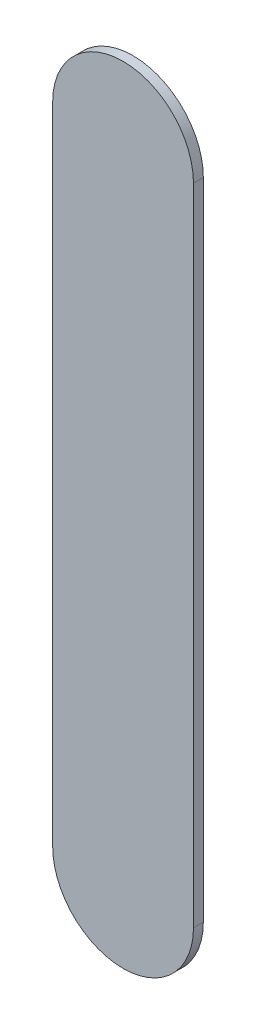
ISO-10303-21;
HEADER;
FILE_DESCRIPTION(('STEP AP214'),'2;1');
FILE_NAME('part.step','',(''),(''),'','','');
FILE_SCHEMA(('AUTOMOTIVE_DESIGN { 1 0 10303 214 1 1 1 1 }'));
ENDSEC;
DATA;
#1=APPLICATION_CONTEXT('core data for automotive mechanical design processes');
#2=APPLICATION_PROTOCOL_DEFINITION('international standard','automotive_design',2000,#1);
#3=PRODUCT_CONTEXT('',#1,'mechanical');
#4=PRODUCT('Part','Part','',(#3));
#5=PRODUCT_RELATED_PRODUCT_CATEGORY('part','',(#4));
#6=PRODUCT_DEFINITION_FORMATION('','',#4);
#7=PRODUCT_DEFINITION_CONTEXT('part definition',#1,'design');
#8=PRODUCT_DEFINITION('design','',#6,#7);
#9=PRODUCT_DEFINITION_SHAPE('','',#8);
#10=(LENGTH_UNIT() NAMED_UNIT(*) SI_UNIT(.MILLI.,.METRE.));
#11=(NAMED_UNIT(*) PLANE_ANGLE_UNIT() SI_UNIT($,.RADIAN.));
#12=(NAMED_UNIT(*) SI_UNIT($,.STERADIAN.) SOLID_ANGLE_UNIT());
#13=UNCERTAINTY_MEASURE_WITH_UNIT(LENGTH_MEASURE(1.E-05),#10,'distance_accuracy_value','');
#14=(GEOMETRIC_REPRESENTATION_CONTEXT(3) GLOBAL_UNCERTAINTY_ASSIGNED_CONTEXT((#13)) GLOBAL_UNIT_ASSIGNED_CONTEXT((#10,
#11,#12)) REPRESENTATION_CONTEXT('',''));
#15=CARTESIAN_POINT('',(0.,0.,0.));
#16=DIRECTION('',(0.,0.,1.));
#17=DIRECTION('',(1.,0.,0.));
#18=AXIS2_PLACEMENT_3D('',#15,#16,#17);
#19=CARTESIAN_POINT('',(77.41,-111.16,1.635));
#20=DIRECTION('',(0.,0.,1.));
#21=DIRECTION('',(1.,0.,0.));
#22=AXIS2_PLACEMENT_3D('',#19,#20,#21);
#23=PLANE('',#22);
#24=DIRECTION('',(0.,1.,0.));
#25=VECTOR('',#24,1.);
#26=CARTESIAN_POINT('',(77.41,-111.16,1.635));
#27=LINE('',#26,#25);
#28=CARTESIAN_POINT('',(77.41,-111.16,1.635));
#29=VERTEX_POINT('',#28);
#30=CARTESIAN_POINT('',(77.41,-108.87,1.635));
#31=VERTEX_POINT('',#30);
#32=EDGE_CURVE('E97',#29,#31,#27,.T.);
#33=ORIENTED_EDGE('',*,*,#32,.T.);
#34=CARTESIAN_POINT('',(77.16,-108.87,1.635));
#35=DIRECTION('',(0.,0.,1.));
#36=DIRECTION('',(1.,0.,0.));
#37=AXIS2_PLACEMENT_3D('',#34,#35,#36);
#38=CIRCLE('',#37,0.25);
#39=CARTESIAN_POINT('',(76.91,-108.87,1.635));
#40=VERTEX_POINT('',#39);
#41=EDGE_CURVE('E76',#31,#40,#38,.T.);
#42=ORIENTED_EDGE('',*,*,#41,.T.);
#43=DIRECTION('',(0.,-1.,0.));
#44=VECTOR('',#43,1.);
#45=CARTESIAN_POINT('',(76.91,-108.87,1.635));
#46=LINE('',#45,#44);
#47=CARTESIAN_POINT('',(76.91,-111.16,1.635));
#48=VERTEX_POINT('',#47);
#49=EDGE_CURVE('E20',#40,#48,#46,.T.);
#50=ORIENTED_EDGE('',*,*,#49,.T.);
#51=CARTESIAN_POINT('',(77.16,-111.16,1.635));
#52=DIRECTION('',(0.,0.,1.));
#53=DIRECTION('',(-1.,0.,0.));
#54=AXIS2_PLACEMENT_3D('',#51,#52,#53);
#55=CIRCLE('',#54,0.25);
#56=EDGE_CURVE('E11',#48,#29,#55,.T.);
#57=ORIENTED_EDGE('',*,*,#56,.T.);
#58=EDGE_LOOP('',(#33,#42,#50,#57));
#59=FACE_BOUND('',#58,.T.);
#60=ADVANCED_FACE('F17',(#59),#23,.T.);
#61=CARTESIAN_POINT('',(77.41,-111.16,1.6));
#62=DIRECTION('',(0.,0.,1.));
#63=DIRECTION('',(1.,0.,0.));
#64=AXIS2_PLACEMENT_3D('',#61,#62,#63);
#65=PLANE('',#64);
#66=CARTESIAN_POINT('',(77.16,-111.16,1.6));
#67=DIRECTION('',(0.,0.,1.));
#68=DIRECTION('',(-1.,0.,0.));
#69=AXIS2_PLACEMENT_3D('',#66,#67,#68);
#70=CIRCLE('',#69,0.25);
#71=CARTESIAN_POINT('',(76.91,-111.16,1.6));
#72=VERTEX_POINT('',#71);
#73=CARTESIAN_POINT('',(77.41,-111.16,1.6));
#74=VERTEX_POINT('',#73);
#75=EDGE_CURVE('E26',#72,#74,#70,.T.);
#76=ORIENTED_EDGE('',*,*,#75,.F.);
#77=DIRECTION('',(0.,-1.,0.));
#78=VECTOR('',#77,1.);
#79=CARTESIAN_POINT('',(76.91,-108.87,1.6));
#80=LINE('',#79,#78);
#81=CARTESIAN_POINT('',(76.91,-108.87,1.6));
#82=VERTEX_POINT('',#81);
#83=EDGE_CURVE('E66',#82,#72,#80,.T.);
#84=ORIENTED_EDGE('',*,*,#83,.F.);
#85=CARTESIAN_POINT('',(77.16,-108.87,1.6));
#86=DIRECTION('',(0.,0.,1.));
#87=DIRECTION('',(1.,0.,0.));
#88=AXIS2_PLACEMENT_3D('',#85,#86,#87);
#89=CIRCLE('',#88,0.25);
#90=CARTESIAN_POINT('',(77.41,-108.87,1.6));
#91=VERTEX_POINT('',#90);
#92=EDGE_CURVE('E70',#91,#82,#89,.T.);
#93=ORIENTED_EDGE('',*,*,#92,.F.);
#94=DIRECTION('',(0.,1.,0.));
#95=VECTOR('',#94,1.);
#96=CARTESIAN_POINT('',(77.41,-111.16,1.6));
#97=LINE('',#96,#95);
#98=EDGE_CURVE('E115',#74,#91,#97,.T.);
#99=ORIENTED_EDGE('',*,*,#98,.F.);
#100=EDGE_LOOP('',(#76,#84,#93,#99));
#101=FACE_BOUND('',#100,.T.);
#102=ADVANCED_FACE('F68',(#101),#65,.F.);
#103=CARTESIAN_POINT('',(77.16,-111.16,1.6));
#104=DIRECTION('',(0.,0.,-1.));
#105=DIRECTION('',(-1.,0.,0.));
#106=AXIS2_PLACEMENT_3D('',#103,#104,#105);
#107=CYLINDRICAL_SURFACE('',#106,0.25);
#108=ORIENTED_EDGE('',*,*,#75,.T.);
#109=DIRECTION('',(0.,0.,1.));
#110=VECTOR('',#109,1.);
#111=CARTESIAN_POINT('',(77.41,-111.16,1.6));
#112=LINE('',#111,#110);
#113=EDGE_CURVE('E91',#74,#29,#112,.T.);
#114=ORIENTED_EDGE('',*,*,#113,.T.);
#115=ORIENTED_EDGE('',*,*,#56,.F.);
#116=DIRECTION('',(0.,0.,1.));
#117=VECTOR('',#116,1.);
#118=CARTESIAN_POINT('',(76.91,-111.16,1.6));
#119=LINE('',#118,#117);
#120=EDGE_CURVE('E75',#72,#48,#119,.T.);
#121=ORIENTED_EDGE('',*,*,#120,.F.);
#122=EDGE_LOOP('',(#108,#114,#115,#121));
#123=FACE_BOUND('',#122,.T.);
#124=ADVANCED_FACE('F142',(#123),#107,.T.);
#125=CARTESIAN_POINT('',(76.91,-108.87,1.6));
#126=DIRECTION('',(1.,0.,0.));
#127=DIRECTION('',(0.,1.,0.));
#128=AXIS2_PLACEMENT_3D('',#125,#126,#127);
#129=PLANE('',#128);
#130=ORIENTED_EDGE('',*,*,#83,.T.);
#131=ORIENTED_EDGE('',*,*,#120,.T.);
#132=ORIENTED_EDGE('',*,*,#49,.F.);
#133=DIRECTION('',(0.,0.,1.));
#134=VECTOR('',#133,1.);
#135=CARTESIAN_POINT('',(76.91,-108.87,1.6));
#136=LINE('',#135,#134);
#137=EDGE_CURVE('E79',#82,#40,#136,.T.);
#138=ORIENTED_EDGE('',*,*,#137,.F.);
#139=EDGE_LOOP('',(#130,#131,#132,#138));
#140=FACE_BOUND('',#139,.T.);
#141=ADVANCED_FACE('F80',(#140),#129,.F.);
#142=CARTESIAN_POINT('',(77.16,-108.87,1.6));
#143=DIRECTION('',(0.,0.,-1.));
#144=DIRECTION('',(1.,0.,0.));
#145=AXIS2_PLACEMENT_3D('',#142,#143,#144);
#146=CYLINDRICAL_SURFACE('',#145,0.25);
#147=ORIENTED_EDGE('',*,*,#92,.T.);
#148=ORIENTED_EDGE('',*,*,#137,.T.);
#149=ORIENTED_EDGE('',*,*,#41,.F.);
#150=DIRECTION('',(0.,0.,1.));
#151=VECTOR('',#150,1.);
#152=CARTESIAN_POINT('',(77.41,-108.87,1.6));
#153=LINE('',#152,#151);
#154=EDGE_CURVE('E88',#91,#31,#153,.T.);
#155=ORIENTED_EDGE('',*,*,#154,.F.);
#156=EDGE_LOOP('',(#147,#148,#149,#155));
#157=FACE_BOUND('',#156,.T.);
#158=ADVANCED_FACE('F86',(#157),#146,.T.);
#159=CARTESIAN_POINT('',(77.41,-111.16,1.6));
#160=DIRECTION('',(-1.,0.,0.));
#161=DIRECTION('',(0.,0.,1.));
#162=AXIS2_PLACEMENT_3D('',#159,#160,#161);
#163=PLANE('',#162);
#164=ORIENTED_EDGE('',*,*,#98,.T.);
#165=ORIENTED_EDGE('',*,*,#154,.T.);
#166=ORIENTED_EDGE('',*,*,#32,.F.);
#167=ORIENTED_EDGE('',*,*,#113,.F.);
#168=EDGE_LOOP('',(#164,#165,#166,#167));
#169=FACE_BOUND('',#168,.T.);
#170=ADVANCED_FACE('F126',(#169),#163,.F.);
#171=CLOSED_SHELL('',(#60,#102,#124,#141,#158,#170));
#172=MANIFOLD_SOLID_BREP('B1',#171);
#173=ADVANCED_BREP_SHAPE_REPRESENTATION('',(#18,#172),#14);
#174=SHAPE_DEFINITION_REPRESENTATION(#9,#173);
ENDSEC;
END-ISO-10303-21;
